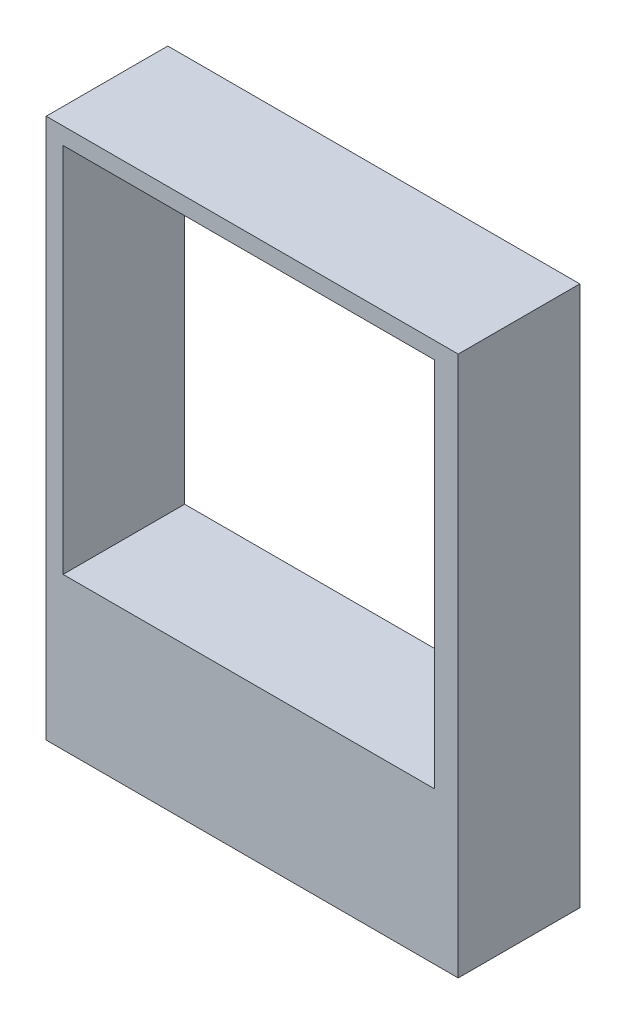
ISO-10303-21;
HEADER;
FILE_DESCRIPTION(('STEP AP214'),'2;1');
FILE_NAME('part.step','',(''),(''),'','','');
FILE_SCHEMA(('AUTOMOTIVE_DESIGN { 1 0 10303 214 1 1 1 1 }'));
ENDSEC;
DATA;
#1=APPLICATION_CONTEXT('core data for automotive mechanical design processes');
#2=APPLICATION_PROTOCOL_DEFINITION('international standard','automotive_design',2000,#1);
#3=PRODUCT_CONTEXT('',#1,'mechanical');
#4=PRODUCT('Part','Part','',(#3));
#5=PRODUCT_RELATED_PRODUCT_CATEGORY('part','',(#4));
#6=PRODUCT_DEFINITION_FORMATION('','',#4);
#7=PRODUCT_DEFINITION_CONTEXT('part definition',#1,'design');
#8=PRODUCT_DEFINITION('design','',#6,#7);
#9=PRODUCT_DEFINITION_SHAPE('','',#8);
#10=(LENGTH_UNIT() NAMED_UNIT(*) SI_UNIT(.MILLI.,.METRE.));
#11=(NAMED_UNIT(*) PLANE_ANGLE_UNIT() SI_UNIT($,.RADIAN.));
#12=(NAMED_UNIT(*) SI_UNIT($,.STERADIAN.) SOLID_ANGLE_UNIT());
#13=UNCERTAINTY_MEASURE_WITH_UNIT(LENGTH_MEASURE(1.E-05),#10,'distance_accuracy_value','');
#14=(GEOMETRIC_REPRESENTATION_CONTEXT(3) GLOBAL_UNCERTAINTY_ASSIGNED_CONTEXT((#13)) GLOBAL_UNIT_ASSIGNED_CONTEXT((#10,
#11,#12)) REPRESENTATION_CONTEXT('',''));
#15=CARTESIAN_POINT('',(0.,0.,0.));
#16=DIRECTION('',(0.,0.,1.));
#17=DIRECTION('',(1.,0.,0.));
#18=AXIS2_PLACEMENT_3D('',#15,#16,#17);
#19=CARTESIAN_POINT('',(0.,0.,36.));
#20=DIRECTION('',(0.,0.,-1.));
#21=DIRECTION('',(-1.,0.,0.));
#22=AXIS2_PLACEMENT_3D('',#19,#20,#21);
#23=PLANE('',#22);
#24=DIRECTION('',(0.,-1.,0.));
#25=VECTOR('',#24,1.);
#26=CARTESIAN_POINT('',(3.12292732747852,2.17836322869955,36.));
#27=LINE('',#26,#25);
#28=CARTESIAN_POINT('',(3.12292732747852,162.1783632287,36.));
#29=VERTEX_POINT('',#28);
#30=CARTESIAN_POINT('',(3.12292732747852,2.17836322869955,36.));
#31=VERTEX_POINT('',#30);
#32=EDGE_CURVE('E133',#29,#31,#27,.T.);
#33=ORIENTED_EDGE('',*,*,#32,.T.);
#34=DIRECTION('',(1.,0.,0.));
#35=VECTOR('',#34,1.);
#36=CARTESIAN_POINT('',(3.12292732747852,2.17836322869955,36.));
#37=LINE('',#36,#35);
#38=CARTESIAN_POINT('',(125.122927327479,2.17836322869955,36.));
#39=VERTEX_POINT('',#38);
#40=EDGE_CURVE('E136',#31,#39,#37,.T.);
#41=ORIENTED_EDGE('',*,*,#40,.T.);
#42=DIRECTION('',(0.,1.,0.));
#43=VECTOR('',#42,1.);
#44=CARTESIAN_POINT('',(125.122927327479,2.17836322869955,36.));
#45=LINE('',#44,#43);
#46=CARTESIAN_POINT('',(125.122927327479,162.1783632287,36.));
#47=VERTEX_POINT('',#46);
#48=EDGE_CURVE('E139',#39,#47,#45,.T.);
#49=ORIENTED_EDGE('',*,*,#48,.T.);
#50=DIRECTION('',(-1.,0.,0.));
#51=VECTOR('',#50,1.);
#52=CARTESIAN_POINT('',(3.12292732747852,162.1783632287,36.));
#53=LINE('',#52,#51);
#54=EDGE_CURVE('E141',#47,#29,#53,.T.);
#55=ORIENTED_EDGE('',*,*,#54,.T.);
#56=EDGE_LOOP('',(#33,#41,#49,#55));
#57=FACE_BOUND('',#56,.T.);
#58=DIRECTION('',(0.,-1.,0.));
#59=VECTOR('',#58,1.);
#60=CARTESIAN_POINT('',(8.12292732747852,157.1783632287,36.));
#61=LINE('',#60,#59);
#62=CARTESIAN_POINT('',(8.12292732747852,157.1783632287,36.));
#63=VERTEX_POINT('',#62);
#64=CARTESIAN_POINT('',(8.12292732747854,47.1783632286995,36.));
#65=VERTEX_POINT('',#64);
#66=EDGE_CURVE('E97',#63,#65,#61,.T.);
#67=ORIENTED_EDGE('',*,*,#66,.F.);
#68=DIRECTION('',(-1.,0.,0.));
#69=VECTOR('',#68,1.);
#70=CARTESIAN_POINT('',(8.12292732747852,157.1783632287,36.));
#71=LINE('',#70,#69);
#72=CARTESIAN_POINT('',(118.122927327479,157.1783632287,36.));
#73=VERTEX_POINT('',#72);
#74=EDGE_CURVE('E119',#73,#63,#71,.T.);
#75=ORIENTED_EDGE('',*,*,#74,.F.);
#76=DIRECTION('',(0.,1.,0.));
#77=VECTOR('',#76,1.);
#78=CARTESIAN_POINT('',(118.122927327479,157.1783632287,36.));
#79=LINE('',#78,#77);
#80=CARTESIAN_POINT('',(118.122927327479,47.1783632286995,36.));
#81=VERTEX_POINT('',#80);
#82=EDGE_CURVE('E117',#81,#73,#79,.T.);
#83=ORIENTED_EDGE('',*,*,#82,.F.);
#84=DIRECTION('',(1.,0.,0.));
#85=VECTOR('',#84,1.);
#86=CARTESIAN_POINT('',(8.12292732747854,47.1783632286995,36.));
#87=LINE('',#86,#85);
#88=EDGE_CURVE('E105',#65,#81,#87,.T.);
#89=ORIENTED_EDGE('',*,*,#88,.F.);
#90=EDGE_LOOP('',(#67,#75,#83,#89));
#91=FACE_BOUND('',#90,.T.);
#92=ADVANCED_FACE('F32',(#57,#91),#23,.F.);
#93=CARTESIAN_POINT('',(0.,0.,0.));
#94=DIRECTION('',(0.,0.,-1.));
#95=DIRECTION('',(-1.,0.,0.));
#96=AXIS2_PLACEMENT_3D('',#93,#94,#95);
#97=PLANE('',#96);
#98=DIRECTION('',(0.,-1.,0.));
#99=VECTOR('',#98,1.);
#100=CARTESIAN_POINT('',(3.12292732747852,2.17836322869955,0.));
#101=LINE('',#100,#99);
#102=CARTESIAN_POINT('',(3.12292732747852,162.1783632287,0.));
#103=VERTEX_POINT('',#102);
#104=CARTESIAN_POINT('',(3.12292732747852,2.17836322869955,0.));
#105=VERTEX_POINT('',#104);
#106=EDGE_CURVE('E113',#103,#105,#101,.T.);
#107=ORIENTED_EDGE('',*,*,#106,.F.);
#108=DIRECTION('',(-1.,0.,0.));
#109=VECTOR('',#108,1.);
#110=CARTESIAN_POINT('',(3.12292732747852,162.1783632287,0.));
#111=LINE('',#110,#109);
#112=CARTESIAN_POINT('',(125.122927327479,162.1783632287,0.));
#113=VERTEX_POINT('',#112);
#114=EDGE_CURVE('E137',#113,#103,#111,.T.);
#115=ORIENTED_EDGE('',*,*,#114,.F.);
#116=DIRECTION('',(0.,1.,0.));
#117=VECTOR('',#116,1.);
#118=CARTESIAN_POINT('',(125.122927327479,2.17836322869955,0.));
#119=LINE('',#118,#117);
#120=CARTESIAN_POINT('',(125.122927327479,2.17836322869955,0.));
#121=VERTEX_POINT('',#120);
#122=EDGE_CURVE('E148',#121,#113,#119,.T.);
#123=ORIENTED_EDGE('',*,*,#122,.F.);
#124=DIRECTION('',(1.,0.,0.));
#125=VECTOR('',#124,1.);
#126=CARTESIAN_POINT('',(3.12292732747852,2.17836322869955,0.));
#127=LINE('',#126,#125);
#128=EDGE_CURVE('E146',#105,#121,#127,.T.);
#129=ORIENTED_EDGE('',*,*,#128,.F.);
#130=EDGE_LOOP('',(#107,#115,#123,#129));
#131=FACE_BOUND('',#130,.T.);
#132=DIRECTION('',(-1.,0.,0.));
#133=VECTOR('',#132,1.);
#134=CARTESIAN_POINT('',(8.12292732747852,157.1783632287,0.));
#135=LINE('',#134,#133);
#136=CARTESIAN_POINT('',(118.122927327479,157.1783632287,0.));
#137=VERTEX_POINT('',#136);
#138=CARTESIAN_POINT('',(8.12292732747852,157.1783632287,0.));
#139=VERTEX_POINT('',#138);
#140=EDGE_CURVE('E106',#137,#139,#135,.T.);
#141=ORIENTED_EDGE('',*,*,#140,.T.);
#142=DIRECTION('',(0.,-1.,0.));
#143=VECTOR('',#142,1.);
#144=CARTESIAN_POINT('',(8.12292732747852,157.1783632287,0.));
#145=LINE('',#144,#143);
#146=CARTESIAN_POINT('',(8.12292732747854,47.1783632286995,0.));
#147=VERTEX_POINT('',#146);
#148=EDGE_CURVE('E55',#139,#147,#145,.T.);
#149=ORIENTED_EDGE('',*,*,#148,.T.);
#150=DIRECTION('',(1.,0.,0.));
#151=VECTOR('',#150,1.);
#152=CARTESIAN_POINT('',(8.12292732747854,47.1783632286995,0.));
#153=LINE('',#152,#151);
#154=CARTESIAN_POINT('',(118.122927327479,47.1783632286995,0.));
#155=VERTEX_POINT('',#154);
#156=EDGE_CURVE('E112',#147,#155,#153,.T.);
#157=ORIENTED_EDGE('',*,*,#156,.T.);
#158=DIRECTION('',(0.,1.,0.));
#159=VECTOR('',#158,1.);
#160=CARTESIAN_POINT('',(118.122927327479,157.1783632287,0.));
#161=LINE('',#160,#159);
#162=EDGE_CURVE('E125',#155,#137,#161,.T.);
#163=ORIENTED_EDGE('',*,*,#162,.T.);
#164=EDGE_LOOP('',(#141,#149,#157,#163));
#165=FACE_BOUND('',#164,.T.);
#166=ADVANCED_FACE('F166',(#131,#165),#97,.T.);
#167=CARTESIAN_POINT('',(3.12292732747852,2.17836322869955,36.));
#168=DIRECTION('',(1.,0.,0.));
#169=DIRECTION('',(0.,0.,-1.));
#170=AXIS2_PLACEMENT_3D('',#167,#168,#169);
#171=PLANE('',#170);
#172=ORIENTED_EDGE('',*,*,#106,.T.);
#173=DIRECTION('',(0.,0.,-1.));
#174=VECTOR('',#173,1.);
#175=CARTESIAN_POINT('',(3.12292732747852,2.17836322869955,36.));
#176=LINE('',#175,#174);
#177=EDGE_CURVE('E11',#31,#105,#176,.T.);
#178=ORIENTED_EDGE('',*,*,#177,.F.);
#179=ORIENTED_EDGE('',*,*,#32,.F.);
#180=DIRECTION('',(0.,0.,-1.));
#181=VECTOR('',#180,1.);
#182=CARTESIAN_POINT('',(3.12292732747852,162.1783632287,36.));
#183=LINE('',#182,#181);
#184=EDGE_CURVE('E143',#29,#103,#183,.T.);
#185=ORIENTED_EDGE('',*,*,#184,.T.);
#186=EDGE_LOOP('',(#172,#178,#179,#185));
#187=FACE_BOUND('',#186,.T.);
#188=ADVANCED_FACE('F34',(#187),#171,.F.);
#189=CARTESIAN_POINT('',(3.12292732747852,2.17836322869955,36.));
#190=DIRECTION('',(0.,1.,0.));
#191=DIRECTION('',(-1.,0.,0.));
#192=AXIS2_PLACEMENT_3D('',#189,#190,#191);
#193=PLANE('',#192);
#194=ORIENTED_EDGE('',*,*,#128,.T.);
#195=DIRECTION('',(0.,0.,-1.));
#196=VECTOR('',#195,1.);
#197=CARTESIAN_POINT('',(125.122927327479,2.17836322869955,36.));
#198=LINE('',#197,#196);
#199=EDGE_CURVE('E40',#39,#121,#198,.T.);
#200=ORIENTED_EDGE('',*,*,#199,.F.);
#201=ORIENTED_EDGE('',*,*,#40,.F.);
#202=ORIENTED_EDGE('',*,*,#177,.T.);
#203=EDGE_LOOP('',(#194,#200,#201,#202));
#204=FACE_BOUND('',#203,.T.);
#205=ADVANCED_FACE('F176',(#204),#193,.F.);
#206=CARTESIAN_POINT('',(125.122927327479,2.17836322869955,36.));
#207=DIRECTION('',(-1.,0.,0.));
#208=DIRECTION('',(0.,0.,1.));
#209=AXIS2_PLACEMENT_3D('',#206,#207,#208);
#210=PLANE('',#209);
#211=ORIENTED_EDGE('',*,*,#122,.T.);
#212=DIRECTION('',(0.,0.,-1.));
#213=VECTOR('',#212,1.);
#214=CARTESIAN_POINT('',(125.122927327479,162.1783632287,36.));
#215=LINE('',#214,#213);
#216=EDGE_CURVE('E153',#47,#113,#215,.T.);
#217=ORIENTED_EDGE('',*,*,#216,.F.);
#218=ORIENTED_EDGE('',*,*,#48,.F.);
#219=ORIENTED_EDGE('',*,*,#199,.T.);
#220=EDGE_LOOP('',(#211,#217,#218,#219));
#221=FACE_BOUND('',#220,.T.);
#222=ADVANCED_FACE('F160',(#221),#210,.F.);
#223=CARTESIAN_POINT('',(3.12292732747852,162.1783632287,36.));
#224=DIRECTION('',(0.,-1.,0.));
#225=DIRECTION('',(0.,0.,-1.));
#226=AXIS2_PLACEMENT_3D('',#223,#224,#225);
#227=PLANE('',#226);
#228=ORIENTED_EDGE('',*,*,#114,.T.);
#229=ORIENTED_EDGE('',*,*,#184,.F.);
#230=ORIENTED_EDGE('',*,*,#54,.F.);
#231=ORIENTED_EDGE('',*,*,#216,.T.);
#232=EDGE_LOOP('',(#228,#229,#230,#231));
#233=FACE_BOUND('',#232,.T.);
#234=ADVANCED_FACE('F170',(#233),#227,.F.);
#235=CARTESIAN_POINT('',(8.12292732747852,157.1783632287,36.));
#236=DIRECTION('',(1.,0.,0.));
#237=DIRECTION('',(0.,1.,0.));
#238=AXIS2_PLACEMENT_3D('',#235,#236,#237);
#239=PLANE('',#238);
#240=ORIENTED_EDGE('',*,*,#148,.F.);
#241=DIRECTION('',(0.,0.,-1.));
#242=VECTOR('',#241,1.);
#243=CARTESIAN_POINT('',(8.12292732747852,157.1783632287,36.));
#244=LINE('',#243,#242);
#245=EDGE_CURVE('E101',#63,#139,#244,.T.);
#246=ORIENTED_EDGE('',*,*,#245,.F.);
#247=ORIENTED_EDGE('',*,*,#66,.T.);
#248=DIRECTION('',(0.,0.,-1.));
#249=VECTOR('',#248,1.);
#250=CARTESIAN_POINT('',(8.12292732747854,47.1783632286995,36.));
#251=LINE('',#250,#249);
#252=EDGE_CURVE('E100',#65,#147,#251,.T.);
#253=ORIENTED_EDGE('',*,*,#252,.T.);
#254=EDGE_LOOP('',(#240,#246,#247,#253));
#255=FACE_BOUND('',#254,.T.);
#256=ADVANCED_FACE('F99',(#255),#239,.T.);
#257=CARTESIAN_POINT('',(8.12292732747854,47.1783632286995,36.));
#258=DIRECTION('',(0.,1.,0.));
#259=DIRECTION('',(0.,0.,1.));
#260=AXIS2_PLACEMENT_3D('',#257,#258,#259);
#261=PLANE('',#260);
#262=ORIENTED_EDGE('',*,*,#156,.F.);
#263=ORIENTED_EDGE('',*,*,#252,.F.);
#264=ORIENTED_EDGE('',*,*,#88,.T.);
#265=DIRECTION('',(0.,0.,-1.));
#266=VECTOR('',#265,1.);
#267=CARTESIAN_POINT('',(118.122927327479,47.1783632286995,36.));
#268=LINE('',#267,#266);
#269=EDGE_CURVE('E114',#81,#155,#268,.T.);
#270=ORIENTED_EDGE('',*,*,#269,.T.);
#271=EDGE_LOOP('',(#262,#263,#264,#270));
#272=FACE_BOUND('',#271,.T.);
#273=ADVANCED_FACE('F109',(#272),#261,.T.);
#274=CARTESIAN_POINT('',(118.122927327479,157.1783632287,36.));
#275=DIRECTION('',(-1.,0.,0.));
#276=DIRECTION('',(0.,-1.,0.));
#277=AXIS2_PLACEMENT_3D('',#274,#275,#276);
#278=PLANE('',#277);
#279=ORIENTED_EDGE('',*,*,#162,.F.);
#280=ORIENTED_EDGE('',*,*,#269,.F.);
#281=ORIENTED_EDGE('',*,*,#82,.T.);
#282=DIRECTION('',(0.,0.,-1.));
#283=VECTOR('',#282,1.);
#284=CARTESIAN_POINT('',(118.122927327479,157.1783632287,36.));
#285=LINE('',#284,#283);
#286=EDGE_CURVE('E47',#73,#137,#285,.T.);
#287=ORIENTED_EDGE('',*,*,#286,.T.);
#288=EDGE_LOOP('',(#279,#280,#281,#287));
#289=FACE_BOUND('',#288,.T.);
#290=ADVANCED_FACE('F199',(#289),#278,.T.);
#291=CARTESIAN_POINT('',(8.12292732747852,157.1783632287,36.));
#292=DIRECTION('',(0.,-1.,0.));
#293=DIRECTION('',(0.,0.,-1.));
#294=AXIS2_PLACEMENT_3D('',#291,#292,#293);
#295=PLANE('',#294);
#296=ORIENTED_EDGE('',*,*,#140,.F.);
#297=ORIENTED_EDGE('',*,*,#286,.F.);
#298=ORIENTED_EDGE('',*,*,#74,.T.);
#299=ORIENTED_EDGE('',*,*,#245,.T.);
#300=EDGE_LOOP('',(#296,#297,#298,#299));
#301=FACE_BOUND('',#300,.T.);
#302=ADVANCED_FACE('F203',(#301),#295,.T.);
#303=CLOSED_SHELL('',(#92,#166,#188,#205,#222,#234,#256,#273,#290,#302));
#304=MANIFOLD_SOLID_BREP('B2',#303);
#305=ADVANCED_BREP_SHAPE_REPRESENTATION('',(#18,#304),#14);
#306=SHAPE_DEFINITION_REPRESENTATION(#9,#305);
ENDSEC;
END-ISO-10303-21;
